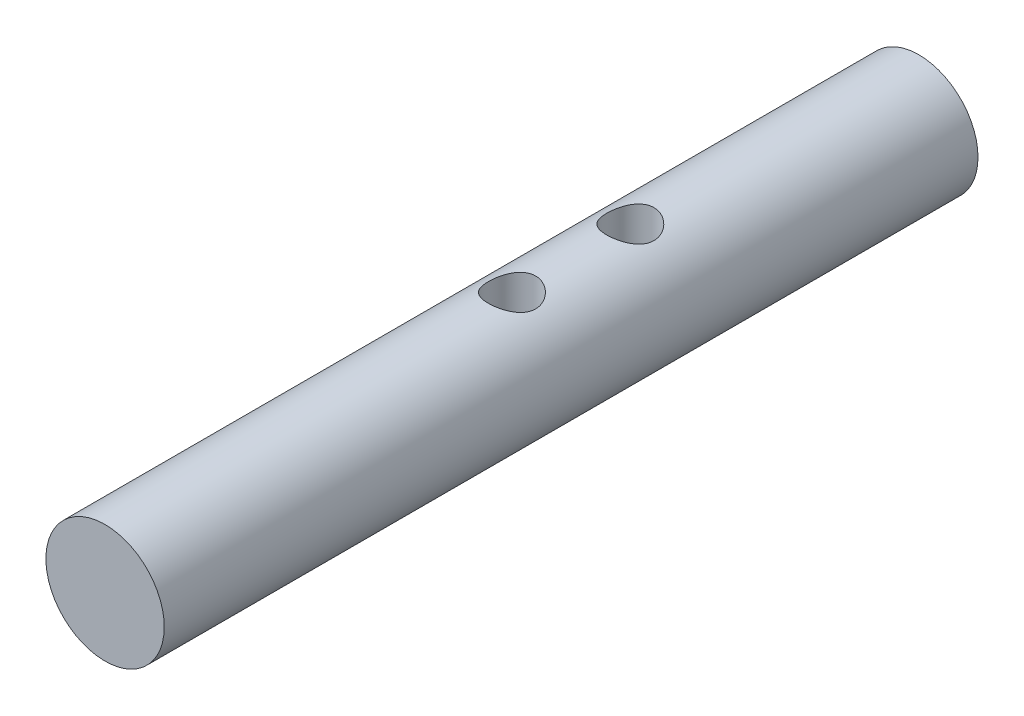
ISO-10303-21;
HEADER;
FILE_DESCRIPTION(('STEP AP214'),'2;1');
FILE_NAME('part.step','',(''),(''),'','','');
FILE_SCHEMA(('AUTOMOTIVE_DESIGN { 1 0 10303 214 1 1 1 1 }'));
ENDSEC;
DATA;
#1=APPLICATION_CONTEXT('core data for automotive mechanical design processes');
#2=APPLICATION_PROTOCOL_DEFINITION('international standard','automotive_design',2000,#1);
#3=PRODUCT_CONTEXT('',#1,'mechanical');
#4=PRODUCT('Part','Part','',(#3));
#5=PRODUCT_RELATED_PRODUCT_CATEGORY('part','',(#4));
#6=PRODUCT_DEFINITION_FORMATION('','',#4);
#7=PRODUCT_DEFINITION_CONTEXT('part definition',#1,'design');
#8=PRODUCT_DEFINITION('design','',#6,#7);
#9=PRODUCT_DEFINITION_SHAPE('','',#8);
#10=(LENGTH_UNIT() NAMED_UNIT(*) SI_UNIT(.MILLI.,.METRE.));
#11=(NAMED_UNIT(*) PLANE_ANGLE_UNIT() SI_UNIT($,.RADIAN.));
#12=(NAMED_UNIT(*) SI_UNIT($,.STERADIAN.) SOLID_ANGLE_UNIT());
#13=UNCERTAINTY_MEASURE_WITH_UNIT(LENGTH_MEASURE(1.E-05),#10,'distance_accuracy_value','');
#14=(GEOMETRIC_REPRESENTATION_CONTEXT(3) GLOBAL_UNCERTAINTY_ASSIGNED_CONTEXT((#13)) GLOBAL_UNIT_ASSIGNED_CONTEXT((#10,
#11,#12)) REPRESENTATION_CONTEXT('',''));
#15=CARTESIAN_POINT('',(0.,0.,0.));
#16=DIRECTION('',(0.,0.,1.));
#17=DIRECTION('',(1.,0.,0.));
#18=AXIS2_PLACEMENT_3D('',#15,#16,#17);
#19=CARTESIAN_POINT('',(0.,0.,55.));
#20=DIRECTION('',(0.,0.,-1.));
#21=DIRECTION('',(-1.,0.,0.));
#22=AXIS2_PLACEMENT_3D('',#19,#20,#21);
#23=CYLINDRICAL_SURFACE('',#22,4.);
#24=CARTESIAN_POINT('',(0.,-4.,21.1));
#25=CARTESIAN_POINT('',(0.0859944043543129,-3.99999416981668,21.099992118541));
#26=CARTESIAN_POINT('',(0.172138051272539,-3.99719435445546,21.0930257983293));
#27=CARTESIAN_POINT('',(0.341997184334316,-3.98626762480513,21.065401837183));
#28=CARTESIAN_POINT('',(0.425705422048998,-3.97812622959102,21.0447069767311));
#29=CARTESIAN_POINT('',(0.587963138181922,-3.95739367370495,20.9904991375529));
#30=CARTESIAN_POINT('',(0.666528529293567,-3.94481709091258,20.9570281230266));
#31=CARTESIAN_POINT('',(0.816857576262694,-3.91645288636862,20.8783846613388));
#32=CARTESIAN_POINT('',(0.888623581400793,-3.90066637966445,20.8332162760649));
#33=CARTESIAN_POINT('',(1.02680080605631,-3.86664708936335,20.7302116011513));
#34=CARTESIAN_POINT('',(1.09284981804017,-3.84833837543352,20.6719146750078));
#35=CARTESIAN_POINT('',(1.21454000382778,-3.81168461524956,20.5452799972186));
#36=CARTESIAN_POINT('',(1.27017608570683,-3.79333955563034,20.4769373622306));
#37=CARTESIAN_POINT('',(1.3718996538343,-3.75778233437709,20.3284575438062));
#38=CARTESIAN_POINT('',(1.41745198495638,-3.74065692771961,20.2479308111814));
#39=CARTESIAN_POINT('',(1.49420377522972,-3.71066917749434,20.079570881264));
#40=CARTESIAN_POINT('',(1.52541005142867,-3.69780480995341,19.9917411777213));
#41=CARTESIAN_POINT('',(1.57111905871669,-3.67861086128655,19.8154301331263));
#42=CARTESIAN_POINT('',(1.58631517264452,-3.67201136284484,19.727159011539));
#43=CARTESIAN_POINT('',(1.60173836931202,-3.66531203239315,19.5490920013542));
#44=CARTESIAN_POINT('',(1.60197281305058,-3.66520900418215,19.4592968843));
#45=CARTESIAN_POINT('',(1.58799149400364,-3.67128400223995,19.2873946628336));
#46=CARTESIAN_POINT('',(1.57478025144411,-3.6770254003076,19.2051874284728));
#47=CARTESIAN_POINT('',(1.53595750423826,-3.69340950086269,19.0442723551946));
#48=CARTESIAN_POINT('',(1.51034383584371,-3.70405305857338,18.9655651295118));
#49=CARTESIAN_POINT('',(1.44695578604086,-3.72927588070824,18.8119857310432));
#50=CARTESIAN_POINT('',(1.40894388985225,-3.7439310342463,18.7372246087563));
#51=CARTESIAN_POINT('',(1.32200516858577,-3.77550493111912,18.5948673469107));
#52=CARTESIAN_POINT('',(1.27307424408067,-3.79242452365479,18.5272739124778));
#53=CARTESIAN_POINT('',(1.16124047956355,-3.82821389393817,18.3956722169584));
#54=CARTESIAN_POINT('',(1.09754997037651,-3.84713331980921,18.3323450164432));
#55=CARTESIAN_POINT('',(0.960251541944153,-3.88367859966626,18.2170524175984));
#56=CARTESIAN_POINT('',(0.886641652267545,-3.9013041955626,18.1650892820718));
#57=CARTESIAN_POINT('',(0.729662122084673,-3.93371745011639,18.0731060420673));
#58=CARTESIAN_POINT('',(0.646128393077181,-3.94844216076332,18.0333421750424));
#59=CARTESIAN_POINT('',(0.472819012386306,-3.97291862663007,17.9686657111376));
#60=CARTESIAN_POINT('',(0.38304655747974,-3.98267290769906,17.9437455699541));
#61=CARTESIAN_POINT('',(0.205516710086257,-3.99564911605528,17.9108413636642));
#62=CARTESIAN_POINT('',(0.117954635188428,-3.99922356666811,17.9019420365972));
#63=CARTESIAN_POINT('',(-0.0574762478462532,-4.00054782808505,17.8986295195771));
#64=CARTESIAN_POINT('',(-0.145344970579138,-3.99829914865833,17.904212574762));
#65=CARTESIAN_POINT('',(-0.31474619129759,-3.98846053651002,17.9290334020416));
#66=CARTESIAN_POINT('',(-0.396385993420379,-3.98111513076419,17.9476463842808));
#67=CARTESIAN_POINT('',(-0.555308342448624,-3.962075531244,17.9971485666479));
#68=CARTESIAN_POINT('',(-0.632590328179875,-3.95038077885224,18.0280393437349));
#69=CARTESIAN_POINT('',(-0.783263028653361,-3.92333275816649,18.102227951744));
#70=CARTESIAN_POINT('',(-0.856462418204323,-3.90787852783843,18.1458763776345));
#71=CARTESIAN_POINT('',(-0.994754872997243,-3.8749869179642,18.2439522591245));
#72=CARTESIAN_POINT('',(-1.0598446726089,-3.85754874488216,18.2983840343381));
#73=CARTESIAN_POINT('',(-1.18457843442305,-3.82116094110489,18.4206960103597));
#74=CARTESIAN_POINT('',(-1.24357914704485,-3.80218753140042,18.489226833205));
#75=CARTESIAN_POINT('',(-1.34940095793097,-3.76593338333706,18.6355520664075));
#76=CARTESIAN_POINT('',(-1.39622004907001,-3.74865292421209,18.713348000272));
#77=CARTESIAN_POINT('',(-1.4766460015453,-3.71771439926167,18.8771693556753));
#78=CARTESIAN_POINT('',(-1.51012047562756,-3.7040930470783,18.9632671993698));
#79=CARTESIAN_POINT('',(-1.56183697576424,-3.68258938782345,19.1405869213721));
#80=CARTESIAN_POINT('',(-1.58009024421545,-3.67470284556799,19.2318049646499));
#81=CARTESIAN_POINT('',(-1.59977249382272,-3.66617407439941,19.4097023214196));
#82=CARTESIAN_POINT('',(-1.60231766584229,-3.66505136806537,19.4962358716747));
#83=CARTESIAN_POINT('',(-1.59344252742202,-3.66891868826478,19.6684358861706));
#84=CARTESIAN_POINT('',(-1.58202399033102,-3.67390793859835,19.7541024591221));
#85=CARTESIAN_POINT('',(-1.54645709292292,-3.68901319263217,19.918665751884));
#86=CARTESIAN_POINT('',(-1.52282999485678,-3.6989186546196,19.9976962195464));
#87=CARTESIAN_POINT('',(-1.46400435879281,-3.72259200986157,20.1507029036908));
#88=CARTESIAN_POINT('',(-1.42880262511505,-3.73636096964805,20.2246777175199));
#89=CARTESIAN_POINT('',(-1.34549821020778,-3.76718887683593,20.3700876954166));
#90=CARTESIAN_POINT('',(-1.29677226812759,-3.78439105850594,20.4411349361044));
#91=CARTESIAN_POINT('',(-1.1887136954172,-3.8197104349779,20.574394653763));
#92=CARTESIAN_POINT('',(-1.1293778678545,-3.83782790438725,20.6366044577026));
#93=CARTESIAN_POINT('',(-0.99720440501797,-3.87434853669915,20.7545622826109));
#94=CARTESIAN_POINT('',(-0.923740800916912,-3.89269406369748,20.8096298455185));
#95=CARTESIAN_POINT('',(-0.767920256228624,-3.92640325370973,20.9066696340973));
#96=CARTESIAN_POINT('',(-0.68555920363779,-3.94176552874325,20.948635769722));
#97=CARTESIAN_POINT('',(-0.515790449996162,-3.96751771852689,21.0172977721522));
#98=CARTESIAN_POINT('',(-0.428505294575756,-3.97799490444022,21.0442634588483));
#99=CARTESIAN_POINT('',(-0.250301237024975,-3.99315444967493,21.0829112967634));
#100=CARTESIAN_POINT('',(-0.159394820687128,-3.9978551959651,21.0946419493951));
#101=CARTESIAN_POINT('',(-0.0455298383127422,-3.99980719603309,21.0995163047826));
#102=CARTESIAN_POINT('',(-0.022770150992606,-4.00000154375341,21.1000020869034));
#103=CARTESIAN_POINT('',(0.,-4.,21.1));
#104=B_SPLINE_CURVE_WITH_KNOTS('',3,(#24,#25,#26,#27,#28,#29,#30,#31,#32,#33,#34,#35,#36,#37,
#38,#39,#40,#41,#42,#43,#44,#45,#46,#47,#48,#49,#50,#51,#52,#53,#54,#55,#56,#57,#58,#59,#60,#61,
#62,#63,#64,#65,#66,#67,#68,#69,#70,#71,#72,#73,#74,#75,#76,#77,#78,#79,#80,#81,#82,#83,#84,#85,
#86,#87,#88,#89,#90,#91,#92,#93,#94,#95,#96,#97,#98,#99,#100,#101,#102,#103),.UNSPECIFIED.,.T.,
.F.,(4,2,2,2,2,2,2,2,2,2,2,2,2,2,2,2,2,2,2,2,2,2,2,2,2,2,2,2,2,2,2,2,2,2,2,2,2,2,2,4),(0.,
0.257922390314456,0.516546908806347,0.774329165977263,1.03202202854387,1.30077905360318,
1.56966715947529,1.85052207055373,2.13124338494614,2.39923284247062,2.6670904507239,
2.91630662721098,3.16556629804838,3.41991301039053,3.67435537550547,3.94846679349246,
4.22263274271787,4.50221530530245,4.78165564891032,5.04455347622406,5.30738314856066,
5.55840364451493,5.80945639195037,6.0681881071861,6.32702367599175,6.60294779699531,
6.87891735234999,7.15756036112662,7.43599738116747,7.69439738714199,7.95276458050437,
8.20091454839016,8.44913308644129,8.71156374445354,8.97407361078715,9.25360338827069,
9.53326290912426,9.80771440810655,10.0812900192347,10.1495843671744),.UNSPECIFIED.);
#105=CARTESIAN_POINT('',(0.,-4.,21.1));
#106=VERTEX_POINT('',#105);
#107=EDGE_CURVE('E10',#106,#106,#104,.T.);
#108=ORIENTED_EDGE('',*,*,#107,.T.);
#109=EDGE_LOOP('',(#108));
#110=FACE_BOUND('',#109,.T.);
#111=CARTESIAN_POINT('',(0.,4.,21.1));
#112=CARTESIAN_POINT('',(-0.0859944043543129,3.99999416981668,21.099992118541));
#113=CARTESIAN_POINT('',(-0.172138051272539,3.99719435445546,21.0930257983293));
#114=CARTESIAN_POINT('',(-0.341997184334316,3.98626762480513,21.065401837183));
#115=CARTESIAN_POINT('',(-0.425705422048998,3.97812622959102,21.0447069767311));
#116=CARTESIAN_POINT('',(-0.587963138181922,3.95739367370495,20.9904991375529));
#117=CARTESIAN_POINT('',(-0.666528529293567,3.94481709091258,20.9570281230266));
#118=CARTESIAN_POINT('',(-0.816857576262694,3.91645288636862,20.8783846613388));
#119=CARTESIAN_POINT('',(-0.888623581400793,3.90066637966445,20.8332162760649));
#120=CARTESIAN_POINT('',(-1.02680080605631,3.86664708936335,20.7302116011513));
#121=CARTESIAN_POINT('',(-1.09284981804017,3.84833837543352,20.6719146750078));
#122=CARTESIAN_POINT('',(-1.21454000382778,3.81168461524956,20.5452799972186));
#123=CARTESIAN_POINT('',(-1.27017608570683,3.79333955563034,20.4769373622306));
#124=CARTESIAN_POINT('',(-1.3718996538343,3.75778233437709,20.3284575438062));
#125=CARTESIAN_POINT('',(-1.41745198495638,3.74065692771961,20.2479308111814));
#126=CARTESIAN_POINT('',(-1.49420377522972,3.71066917749434,20.079570881264));
#127=CARTESIAN_POINT('',(-1.52541005142867,3.69780480995341,19.9917411777213));
#128=CARTESIAN_POINT('',(-1.57111905871669,3.67861086128655,19.8154301331263));
#129=CARTESIAN_POINT('',(-1.58631517264452,3.67201136284484,19.727159011539));
#130=CARTESIAN_POINT('',(-1.60173836931202,3.66531203239315,19.5490920013542));
#131=CARTESIAN_POINT('',(-1.60197281305058,3.66520900418215,19.4592968843));
#132=CARTESIAN_POINT('',(-1.58799149400364,3.67128400223995,19.2873946628336));
#133=CARTESIAN_POINT('',(-1.57478025144411,3.6770254003076,19.2051874284728));
#134=CARTESIAN_POINT('',(-1.53595750423826,3.69340950086269,19.0442723551946));
#135=CARTESIAN_POINT('',(-1.51034383584371,3.70405305857338,18.9655651295118));
#136=CARTESIAN_POINT('',(-1.44695578604086,3.72927588070824,18.8119857310432));
#137=CARTESIAN_POINT('',(-1.40894388985225,3.7439310342463,18.7372246087563));
#138=CARTESIAN_POINT('',(-1.32200516858577,3.77550493111912,18.5948673469107));
#139=CARTESIAN_POINT('',(-1.27307424408067,3.79242452365479,18.5272739124778));
#140=CARTESIAN_POINT('',(-1.16124047956355,3.82821389393817,18.3956722169584));
#141=CARTESIAN_POINT('',(-1.09754997037651,3.84713331980921,18.3323450164432));
#142=CARTESIAN_POINT('',(-0.960251541944153,3.88367859966626,18.2170524175984));
#143=CARTESIAN_POINT('',(-0.886641652267545,3.9013041955626,18.1650892820718));
#144=CARTESIAN_POINT('',(-0.729662122084673,3.93371745011639,18.0731060420673));
#145=CARTESIAN_POINT('',(-0.646128393077181,3.94844216076332,18.0333421750424));
#146=CARTESIAN_POINT('',(-0.472819012386306,3.97291862663007,17.9686657111376));
#147=CARTESIAN_POINT('',(-0.38304655747974,3.98267290769906,17.9437455699541));
#148=CARTESIAN_POINT('',(-0.205516710086257,3.99564911605528,17.9108413636642));
#149=CARTESIAN_POINT('',(-0.117954635188428,3.99922356666811,17.9019420365972));
#150=CARTESIAN_POINT('',(0.0574762478462532,4.00054782808505,17.8986295195771));
#151=CARTESIAN_POINT('',(0.145344970579138,3.99829914865833,17.904212574762));
#152=CARTESIAN_POINT('',(0.31474619129759,3.98846053651002,17.9290334020416));
#153=CARTESIAN_POINT('',(0.396385993420379,3.98111513076419,17.9476463842808));
#154=CARTESIAN_POINT('',(0.555308342448624,3.962075531244,17.9971485666479));
#155=CARTESIAN_POINT('',(0.632590328179875,3.95038077885224,18.0280393437349));
#156=CARTESIAN_POINT('',(0.783263028653361,3.92333275816649,18.102227951744));
#157=CARTESIAN_POINT('',(0.856462418204323,3.90787852783843,18.1458763776345));
#158=CARTESIAN_POINT('',(0.994754872997243,3.8749869179642,18.2439522591245));
#159=CARTESIAN_POINT('',(1.0598446726089,3.85754874488216,18.2983840343381));
#160=CARTESIAN_POINT('',(1.18457843442305,3.82116094110489,18.4206960103597));
#161=CARTESIAN_POINT('',(1.24357914704485,3.80218753140042,18.489226833205));
#162=CARTESIAN_POINT('',(1.34940095793097,3.76593338333706,18.6355520664075));
#163=CARTESIAN_POINT('',(1.39622004907001,3.74865292421209,18.713348000272));
#164=CARTESIAN_POINT('',(1.4766460015453,3.71771439926167,18.8771693556753));
#165=CARTESIAN_POINT('',(1.51012047562756,3.7040930470783,18.9632671993698));
#166=CARTESIAN_POINT('',(1.56183697576424,3.68258938782345,19.1405869213721));
#167=CARTESIAN_POINT('',(1.58009024421545,3.67470284556799,19.2318049646499));
#168=CARTESIAN_POINT('',(1.59977249382272,3.66617407439941,19.4097023214196));
#169=CARTESIAN_POINT('',(1.60231766584229,3.66505136806537,19.4962358716747));
#170=CARTESIAN_POINT('',(1.59344252742202,3.66891868826478,19.6684358861706));
#171=CARTESIAN_POINT('',(1.58202399033102,3.67390793859835,19.7541024591221));
#172=CARTESIAN_POINT('',(1.54645709292292,3.68901319263217,19.918665751884));
#173=CARTESIAN_POINT('',(1.52282999485678,3.6989186546196,19.9976962195464));
#174=CARTESIAN_POINT('',(1.46400435879281,3.72259200986157,20.1507029036908));
#175=CARTESIAN_POINT('',(1.42880262511505,3.73636096964805,20.2246777175199));
#176=CARTESIAN_POINT('',(1.34549821020778,3.76718887683593,20.3700876954166));
#177=CARTESIAN_POINT('',(1.29677226812759,3.78439105850594,20.4411349361044));
#178=CARTESIAN_POINT('',(1.1887136954172,3.8197104349779,20.574394653763));
#179=CARTESIAN_POINT('',(1.1293778678545,3.83782790438725,20.6366044577026));
#180=CARTESIAN_POINT('',(0.99720440501797,3.87434853669915,20.7545622826109));
#181=CARTESIAN_POINT('',(0.923740800916912,3.89269406369748,20.8096298455185));
#182=CARTESIAN_POINT('',(0.767920256228624,3.92640325370973,20.9066696340973));
#183=CARTESIAN_POINT('',(0.68555920363779,3.94176552874325,20.948635769722));
#184=CARTESIAN_POINT('',(0.515790449996162,3.96751771852689,21.0172977721522));
#185=CARTESIAN_POINT('',(0.428505294575756,3.97799490444022,21.0442634588483));
#186=CARTESIAN_POINT('',(0.250301237024975,3.99315444967493,21.0829112967634));
#187=CARTESIAN_POINT('',(0.159394820687128,3.9978551959651,21.0946419493951));
#188=CARTESIAN_POINT('',(0.0455298383127422,3.99980719603309,21.0995163047826));
#189=CARTESIAN_POINT('',(0.022770150992606,4.00000154375341,21.1000020869034));
#190=CARTESIAN_POINT('',(0.,4.,21.1));
#191=B_SPLINE_CURVE_WITH_KNOTS('',3,(#111,#112,#113,#114,#115,#116,#117,#118,#119,#120,#121,
#122,#123,#124,#125,#126,#127,#128,#129,#130,#131,#132,#133,#134,#135,#136,#137,#138,#139,#140,
#141,#142,#143,#144,#145,#146,#147,#148,#149,#150,#151,#152,#153,#154,#155,#156,#157,#158,#159,
#160,#161,#162,#163,#164,#165,#166,#167,#168,#169,#170,#171,#172,#173,#174,#175,#176,#177,#178,
#179,#180,#181,#182,#183,#184,#185,#186,#187,#188,#189,#190),.UNSPECIFIED.,.T.,.F.,(4,2,2,2,2,2,
2,2,2,2,2,2,2,2,2,2,2,2,2,2,2,2,2,2,2,2,2,2,2,2,2,2,2,2,2,2,2,2,2,4),(0.,0.257922390314456,
0.516546908806347,0.774329165977263,1.03202202854387,1.30077905360318,1.56966715947529,
1.85052207055373,2.13124338494614,2.39923284247062,2.6670904507239,2.91630662721098,
3.16556629804838,3.41991301039053,3.67435537550547,3.94846679349246,4.22263274271787,
4.50221530530245,4.78165564891032,5.04455347622406,5.30738314856066,5.55840364451493,
5.80945639195037,6.0681881071861,6.32702367599175,6.60294779699531,6.87891735234999,
7.15756036112662,7.43599738116747,7.69439738714199,7.95276458050437,8.20091454839016,
8.44913308644129,8.71156374445354,8.97407361078715,9.25360338827069,9.53326290912426,
9.80771440810655,10.0812900192347,10.1495843671744),.UNSPECIFIED.);
#192=CARTESIAN_POINT('',(0.,4.,21.1));
#193=VERTEX_POINT('',#192);
#194=EDGE_CURVE('E41',#193,#193,#191,.T.);
#195=ORIENTED_EDGE('',*,*,#194,.T.);
#196=EDGE_LOOP('',(#195));
#197=FACE_BOUND('',#196,.T.);
#198=CARTESIAN_POINT('',(0.,-4.,29.1));
#199=CARTESIAN_POINT('',(0.0859944043543129,-3.99999416981668,29.099992118541));
#200=CARTESIAN_POINT('',(0.172138051272539,-3.99719435445546,29.0930257983293));
#201=CARTESIAN_POINT('',(0.341997184334316,-3.98626762480513,29.065401837183));
#202=CARTESIAN_POINT('',(0.425705422048998,-3.97812622959102,29.0447069767311));
#203=CARTESIAN_POINT('',(0.587963138181922,-3.95739367370495,28.9904991375529));
#204=CARTESIAN_POINT('',(0.666528529293567,-3.94481709091258,28.9570281230266));
#205=CARTESIAN_POINT('',(0.816857576262694,-3.91645288636862,28.8783846613388));
#206=CARTESIAN_POINT('',(0.888623581400793,-3.90066637966445,28.8332162760649));
#207=CARTESIAN_POINT('',(1.02680080605631,-3.86664708936335,28.7302116011513));
#208=CARTESIAN_POINT('',(1.09284981804017,-3.84833837543352,28.6719146750078));
#209=CARTESIAN_POINT('',(1.21454000382778,-3.81168461524956,28.5452799972186));
#210=CARTESIAN_POINT('',(1.27017608570683,-3.79333955563034,28.4769373622306));
#211=CARTESIAN_POINT('',(1.3718996538343,-3.75778233437709,28.3284575438062));
#212=CARTESIAN_POINT('',(1.41745198495638,-3.74065692771961,28.2479308111814));
#213=CARTESIAN_POINT('',(1.49420377522972,-3.71066917749434,28.079570881264));
#214=CARTESIAN_POINT('',(1.52541005142867,-3.69780480995341,27.9917411777213));
#215=CARTESIAN_POINT('',(1.57111905871669,-3.67861086128655,27.8154301331263));
#216=CARTESIAN_POINT('',(1.58631517264452,-3.67201136284484,27.727159011539));
#217=CARTESIAN_POINT('',(1.60173836931202,-3.66531203239315,27.5490920013542));
#218=CARTESIAN_POINT('',(1.60197281305058,-3.66520900418215,27.4592968843));
#219=CARTESIAN_POINT('',(1.58799149400364,-3.67128400223995,27.2873946628336));
#220=CARTESIAN_POINT('',(1.57478025144411,-3.6770254003076,27.2051874284728));
#221=CARTESIAN_POINT('',(1.53595750423826,-3.69340950086269,27.0442723551946));
#222=CARTESIAN_POINT('',(1.51034383584371,-3.70405305857338,26.9655651295118));
#223=CARTESIAN_POINT('',(1.44695578604086,-3.72927588070824,26.8119857310432));
#224=CARTESIAN_POINT('',(1.40894388985225,-3.7439310342463,26.7372246087562));
#225=CARTESIAN_POINT('',(1.32200516858577,-3.77550493111912,26.5948673469107));
#226=CARTESIAN_POINT('',(1.27307424408067,-3.79242452365479,26.5272739124778));
#227=CARTESIAN_POINT('',(1.16124047956355,-3.82821389393817,26.3956722169584));
#228=CARTESIAN_POINT('',(1.09754997037651,-3.84713331980921,26.3323450164432));
#229=CARTESIAN_POINT('',(0.960251541944153,-3.88367859966626,26.2170524175984));
#230=CARTESIAN_POINT('',(0.886641652267545,-3.9013041955626,26.1650892820718));
#231=CARTESIAN_POINT('',(0.729662122084673,-3.93371745011639,26.0731060420673));
#232=CARTESIAN_POINT('',(0.646128393077181,-3.94844216076332,26.0333421750424));
#233=CARTESIAN_POINT('',(0.472819012386306,-3.97291862663007,25.9686657111376));
#234=CARTESIAN_POINT('',(0.38304655747974,-3.98267290769906,25.9437455699541));
#235=CARTESIAN_POINT('',(0.205516710086257,-3.99564911605528,25.9108413636642));
#236=CARTESIAN_POINT('',(0.117954635188429,-3.99922356666811,25.9019420365972));
#237=CARTESIAN_POINT('',(-0.0574762478462531,-4.00054782808505,25.8986295195771));
#238=CARTESIAN_POINT('',(-0.145344970579138,-3.99829914865833,25.904212574762));
#239=CARTESIAN_POINT('',(-0.31474619129759,-3.98846053651002,25.9290334020416));
#240=CARTESIAN_POINT('',(-0.396385993420379,-3.98111513076419,25.9476463842808));
#241=CARTESIAN_POINT('',(-0.555308342448624,-3.962075531244,25.9971485666479));
#242=CARTESIAN_POINT('',(-0.632590328179875,-3.95038077885224,26.0280393437349));
#243=CARTESIAN_POINT('',(-0.783263028653361,-3.92333275816649,26.102227951744));
#244=CARTESIAN_POINT('',(-0.856462418204323,-3.90787852783843,26.1458763776345));
#245=CARTESIAN_POINT('',(-0.994754872997243,-3.8749869179642,26.2439522591245));
#246=CARTESIAN_POINT('',(-1.0598446726089,-3.85754874488216,26.2983840343381));
#247=CARTESIAN_POINT('',(-1.18457843442305,-3.82116094110489,26.4206960103597));
#248=CARTESIAN_POINT('',(-1.24357914704485,-3.80218753140042,26.489226833205));
#249=CARTESIAN_POINT('',(-1.34940095793097,-3.76593338333706,26.6355520664075));
#250=CARTESIAN_POINT('',(-1.39622004907001,-3.74865292421209,26.713348000272));
#251=CARTESIAN_POINT('',(-1.4766460015453,-3.71771439926167,26.8771693556753));
#252=CARTESIAN_POINT('',(-1.51012047562756,-3.7040930470783,26.9632671993698));
#253=CARTESIAN_POINT('',(-1.56183697576424,-3.68258938782345,27.1405869213721));
#254=CARTESIAN_POINT('',(-1.58009024421545,-3.67470284556799,27.2318049646499));
#255=CARTESIAN_POINT('',(-1.59977249382272,-3.66617407439941,27.4097023214196));
#256=CARTESIAN_POINT('',(-1.60231766584229,-3.66505136806537,27.4962358716747));
#257=CARTESIAN_POINT('',(-1.59344252742202,-3.66891868826478,27.6684358861706));
#258=CARTESIAN_POINT('',(-1.58202399033102,-3.67390793859835,27.7541024591221));
#259=CARTESIAN_POINT('',(-1.54645709292292,-3.68901319263217,27.918665751884));
#260=CARTESIAN_POINT('',(-1.52282999485678,-3.6989186546196,27.9976962195464));
#261=CARTESIAN_POINT('',(-1.46400435879281,-3.72259200986157,28.1507029036908));
#262=CARTESIAN_POINT('',(-1.42880262511505,-3.73636096964805,28.2246777175199));
#263=CARTESIAN_POINT('',(-1.34549821020778,-3.76718887683593,28.3700876954166));
#264=CARTESIAN_POINT('',(-1.29677226812759,-3.78439105850594,28.4411349361044));
#265=CARTESIAN_POINT('',(-1.1887136954172,-3.8197104349779,28.574394653763));
#266=CARTESIAN_POINT('',(-1.1293778678545,-3.83782790438725,28.6366044577026));
#267=CARTESIAN_POINT('',(-0.99720440501797,-3.87434853669915,28.7545622826109));
#268=CARTESIAN_POINT('',(-0.923740800916912,-3.89269406369748,28.8096298455185));
#269=CARTESIAN_POINT('',(-0.767920256228624,-3.92640325370973,28.9066696340973));
#270=CARTESIAN_POINT('',(-0.68555920363779,-3.94176552874325,28.948635769722));
#271=CARTESIAN_POINT('',(-0.515790449996162,-3.96751771852689,29.0172977721522));
#272=CARTESIAN_POINT('',(-0.428505294575756,-3.97799490444022,29.0442634588483));
#273=CARTESIAN_POINT('',(-0.250301237024975,-3.99315444967493,29.0829112967634));
#274=CARTESIAN_POINT('',(-0.159394820687128,-3.9978551959651,29.0946419493951));
#275=CARTESIAN_POINT('',(-0.0455298383127422,-3.99980719603309,29.0995163047826));
#276=CARTESIAN_POINT('',(-0.022770150992606,-4.00000154375341,29.1000020869034));
#277=CARTESIAN_POINT('',(0.,-4.,29.1));
#278=B_SPLINE_CURVE_WITH_KNOTS('',3,(#198,#199,#200,#201,#202,#203,#204,#205,#206,#207,#208,
#209,#210,#211,#212,#213,#214,#215,#216,#217,#218,#219,#220,#221,#222,#223,#224,#225,#226,#227,
#228,#229,#230,#231,#232,#233,#234,#235,#236,#237,#238,#239,#240,#241,#242,#243,#244,#245,#246,
#247,#248,#249,#250,#251,#252,#253,#254,#255,#256,#257,#258,#259,#260,#261,#262,#263,#264,#265,
#266,#267,#268,#269,#270,#271,#272,#273,#274,#275,#276,#277),.UNSPECIFIED.,.T.,.F.,(4,2,2,2,2,2,
2,2,2,2,2,2,2,2,2,2,2,2,2,2,2,2,2,2,2,2,2,2,2,2,2,2,2,2,2,2,2,2,2,4),(0.,0.257922390314456,
0.516546908806347,0.774329165977263,1.03202202854387,1.30077905360318,1.56966715947529,
1.85052207055373,2.13124338494614,2.39923284247062,2.6670904507239,2.91630662721098,
3.16556629804838,3.41991301039053,3.67435537550547,3.94846679349246,4.22263274271787,
4.50221530530245,4.78165564891032,5.04455347622406,5.30738314856066,5.55840364451493,
5.80945639195037,6.0681881071861,6.32702367599175,6.60294779699531,6.87891735234999,
7.15756036112662,7.43599738116747,7.69439738714199,7.95276458050437,8.20091454839016,
8.44913308644129,8.71156374445354,8.97407361078715,9.25360338827069,9.53326290912426,
9.80771440810655,10.0812900192347,10.1495843671744),.UNSPECIFIED.);
#279=CARTESIAN_POINT('',(0.,-4.,29.1));
#280=VERTEX_POINT('',#279);
#281=EDGE_CURVE('E45',#280,#280,#278,.T.);
#282=ORIENTED_EDGE('',*,*,#281,.T.);
#283=EDGE_LOOP('',(#282));
#284=FACE_BOUND('',#283,.T.);
#285=CARTESIAN_POINT('',(0.,4.,29.1));
#286=CARTESIAN_POINT('',(-0.0859944043543129,3.99999416981668,29.099992118541));
#287=CARTESIAN_POINT('',(-0.172138051272539,3.99719435445546,29.0930257983293));
#288=CARTESIAN_POINT('',(-0.341997184334316,3.98626762480513,29.065401837183));
#289=CARTESIAN_POINT('',(-0.425705422048998,3.97812622959102,29.0447069767311));
#290=CARTESIAN_POINT('',(-0.587963138181922,3.95739367370495,28.9904991375529));
#291=CARTESIAN_POINT('',(-0.666528529293567,3.94481709091258,28.9570281230266));
#292=CARTESIAN_POINT('',(-0.816857576262694,3.91645288636862,28.8783846613388));
#293=CARTESIAN_POINT('',(-0.888623581400793,3.90066637966445,28.8332162760649));
#294=CARTESIAN_POINT('',(-1.02680080605631,3.86664708936335,28.7302116011513));
#295=CARTESIAN_POINT('',(-1.09284981804017,3.84833837543352,28.6719146750078));
#296=CARTESIAN_POINT('',(-1.21454000382778,3.81168461524956,28.5452799972186));
#297=CARTESIAN_POINT('',(-1.27017608570683,3.79333955563034,28.4769373622306));
#298=CARTESIAN_POINT('',(-1.3718996538343,3.75778233437709,28.3284575438062));
#299=CARTESIAN_POINT('',(-1.41745198495638,3.74065692771961,28.2479308111814));
#300=CARTESIAN_POINT('',(-1.49420377522972,3.71066917749434,28.079570881264));
#301=CARTESIAN_POINT('',(-1.52541005142867,3.69780480995341,27.9917411777213));
#302=CARTESIAN_POINT('',(-1.57111905871669,3.67861086128655,27.8154301331263));
#303=CARTESIAN_POINT('',(-1.58631517264452,3.67201136284484,27.727159011539));
#304=CARTESIAN_POINT('',(-1.60173836931202,3.66531203239315,27.5490920013542));
#305=CARTESIAN_POINT('',(-1.60197281305058,3.66520900418215,27.4592968843));
#306=CARTESIAN_POINT('',(-1.58799149400364,3.67128400223995,27.2873946628336));
#307=CARTESIAN_POINT('',(-1.57478025144411,3.6770254003076,27.2051874284728));
#308=CARTESIAN_POINT('',(-1.53595750423826,3.69340950086269,27.0442723551946));
#309=CARTESIAN_POINT('',(-1.51034383584371,3.70405305857338,26.9655651295118));
#310=CARTESIAN_POINT('',(-1.44695578604086,3.72927588070824,26.8119857310432));
#311=CARTESIAN_POINT('',(-1.40894388985225,3.7439310342463,26.7372246087562));
#312=CARTESIAN_POINT('',(-1.32200516858577,3.77550493111912,26.5948673469107));
#313=CARTESIAN_POINT('',(-1.27307424408067,3.79242452365479,26.5272739124778));
#314=CARTESIAN_POINT('',(-1.16124047956355,3.82821389393817,26.3956722169584));
#315=CARTESIAN_POINT('',(-1.09754997037651,3.84713331980921,26.3323450164432));
#316=CARTESIAN_POINT('',(-0.960251541944153,3.88367859966626,26.2170524175984));
#317=CARTESIAN_POINT('',(-0.886641652267545,3.9013041955626,26.1650892820718));
#318=CARTESIAN_POINT('',(-0.729662122084673,3.93371745011639,26.0731060420673));
#319=CARTESIAN_POINT('',(-0.646128393077181,3.94844216076332,26.0333421750424));
#320=CARTESIAN_POINT('',(-0.472819012386306,3.97291862663007,25.9686657111376));
#321=CARTESIAN_POINT('',(-0.38304655747974,3.98267290769906,25.9437455699541));
#322=CARTESIAN_POINT('',(-0.205516710086257,3.99564911605528,25.9108413636642));
#323=CARTESIAN_POINT('',(-0.117954635188429,3.99922356666811,25.9019420365972));
#324=CARTESIAN_POINT('',(0.0574762478462531,4.00054782808505,25.8986295195771));
#325=CARTESIAN_POINT('',(0.145344970579138,3.99829914865833,25.904212574762));
#326=CARTESIAN_POINT('',(0.31474619129759,3.98846053651002,25.9290334020416));
#327=CARTESIAN_POINT('',(0.396385993420379,3.98111513076419,25.9476463842808));
#328=CARTESIAN_POINT('',(0.555308342448624,3.962075531244,25.9971485666479));
#329=CARTESIAN_POINT('',(0.632590328179875,3.95038077885224,26.0280393437349));
#330=CARTESIAN_POINT('',(0.783263028653361,3.92333275816649,26.102227951744));
#331=CARTESIAN_POINT('',(0.856462418204323,3.90787852783843,26.1458763776345));
#332=CARTESIAN_POINT('',(0.994754872997243,3.8749869179642,26.2439522591245));
#333=CARTESIAN_POINT('',(1.0598446726089,3.85754874488216,26.2983840343381));
#334=CARTESIAN_POINT('',(1.18457843442305,3.82116094110489,26.4206960103597));
#335=CARTESIAN_POINT('',(1.24357914704485,3.80218753140042,26.489226833205));
#336=CARTESIAN_POINT('',(1.34940095793097,3.76593338333706,26.6355520664075));
#337=CARTESIAN_POINT('',(1.39622004907001,3.74865292421209,26.713348000272));
#338=CARTESIAN_POINT('',(1.4766460015453,3.71771439926167,26.8771693556753));
#339=CARTESIAN_POINT('',(1.51012047562756,3.7040930470783,26.9632671993698));
#340=CARTESIAN_POINT('',(1.56183697576424,3.68258938782345,27.1405869213721));
#341=CARTESIAN_POINT('',(1.58009024421545,3.67470284556799,27.2318049646499));
#342=CARTESIAN_POINT('',(1.59977249382272,3.66617407439941,27.4097023214196));
#343=CARTESIAN_POINT('',(1.60231766584229,3.66505136806537,27.4962358716747));
#344=CARTESIAN_POINT('',(1.59344252742202,3.66891868826478,27.6684358861706));
#345=CARTESIAN_POINT('',(1.58202399033102,3.67390793859835,27.7541024591221));
#346=CARTESIAN_POINT('',(1.54645709292292,3.68901319263217,27.918665751884));
#347=CARTESIAN_POINT('',(1.52282999485678,3.6989186546196,27.9976962195464));
#348=CARTESIAN_POINT('',(1.46400435879281,3.72259200986157,28.1507029036908));
#349=CARTESIAN_POINT('',(1.42880262511505,3.73636096964805,28.2246777175199));
#350=CARTESIAN_POINT('',(1.34549821020778,3.76718887683593,28.3700876954166));
#351=CARTESIAN_POINT('',(1.29677226812759,3.78439105850594,28.4411349361044));
#352=CARTESIAN_POINT('',(1.1887136954172,3.8197104349779,28.574394653763));
#353=CARTESIAN_POINT('',(1.1293778678545,3.83782790438725,28.6366044577026));
#354=CARTESIAN_POINT('',(0.99720440501797,3.87434853669915,28.7545622826109));
#355=CARTESIAN_POINT('',(0.923740800916912,3.89269406369748,28.8096298455185));
#356=CARTESIAN_POINT('',(0.767920256228624,3.92640325370973,28.9066696340973));
#357=CARTESIAN_POINT('',(0.68555920363779,3.94176552874325,28.948635769722));
#358=CARTESIAN_POINT('',(0.515790449996162,3.96751771852689,29.0172977721522));
#359=CARTESIAN_POINT('',(0.428505294575756,3.97799490444022,29.0442634588483));
#360=CARTESIAN_POINT('',(0.250301237024975,3.99315444967493,29.0829112967634));
#361=CARTESIAN_POINT('',(0.159394820687128,3.9978551959651,29.0946419493951));
#362=CARTESIAN_POINT('',(0.0455298383127422,3.99980719603309,29.0995163047826));
#363=CARTESIAN_POINT('',(0.022770150992606,4.00000154375341,29.1000020869034));
#364=CARTESIAN_POINT('',(0.,4.,29.1));
#365=B_SPLINE_CURVE_WITH_KNOTS('',3,(#285,#286,#287,#288,#289,#290,#291,#292,#293,#294,#295,
#296,#297,#298,#299,#300,#301,#302,#303,#304,#305,#306,#307,#308,#309,#310,#311,#312,#313,#314,
#315,#316,#317,#318,#319,#320,#321,#322,#323,#324,#325,#326,#327,#328,#329,#330,#331,#332,#333,
#334,#335,#336,#337,#338,#339,#340,#341,#342,#343,#344,#345,#346,#347,#348,#349,#350,#351,#352,
#353,#354,#355,#356,#357,#358,#359,#360,#361,#362,#363,#364),.UNSPECIFIED.,.T.,.F.,(4,2,2,2,2,2,
2,2,2,2,2,2,2,2,2,2,2,2,2,2,2,2,2,2,2,2,2,2,2,2,2,2,2,2,2,2,2,2,2,4),(0.,0.257922390314456,
0.516546908806347,0.774329165977263,1.03202202854387,1.30077905360318,1.56966715947529,
1.85052207055373,2.13124338494614,2.39923284247062,2.6670904507239,2.91630662721098,
3.16556629804838,3.41991301039053,3.67435537550547,3.94846679349246,4.22263274271787,
4.50221530530245,4.78165564891032,5.04455347622406,5.30738314856066,5.55840364451493,
5.80945639195037,6.0681881071861,6.32702367599175,6.60294779699531,6.87891735234999,
7.15756036112662,7.43599738116747,7.69439738714199,7.95276458050437,8.20091454839016,
8.44913308644129,8.71156374445354,8.97407361078715,9.25360338827069,9.53326290912426,
9.80771440810655,10.0812900192347,10.1495843671744),.UNSPECIFIED.);
#366=CARTESIAN_POINT('',(0.,4.,29.1));
#367=VERTEX_POINT('',#366);
#368=EDGE_CURVE('E49',#367,#367,#365,.T.);
#369=ORIENTED_EDGE('',*,*,#368,.T.);
#370=EDGE_LOOP('',(#369));
#371=FACE_BOUND('',#370,.T.);
#372=CARTESIAN_POINT('',(0.,0.,55.));
#373=DIRECTION('',(0.,0.,1.));
#374=DIRECTION('',(1.,0.,0.));
#375=AXIS2_PLACEMENT_3D('',#372,#373,#374);
#376=CIRCLE('',#375,4.);
#377=CARTESIAN_POINT('',(4.,0.,55.));
#378=VERTEX_POINT('',#377);
#379=EDGE_CURVE('E74',#378,#378,#376,.T.);
#380=ORIENTED_EDGE('',*,*,#379,.F.);
#381=EDGE_LOOP('',(#380));
#382=FACE_BOUND('',#381,.T.);
#383=CARTESIAN_POINT('',(0.,0.,0.));
#384=DIRECTION('',(0.,0.,1.));
#385=DIRECTION('',(1.,0.,0.));
#386=AXIS2_PLACEMENT_3D('',#383,#384,#385);
#387=CIRCLE('',#386,4.);
#388=CARTESIAN_POINT('',(4.,0.,0.));
#389=VERTEX_POINT('',#388);
#390=EDGE_CURVE('E75',#389,#389,#387,.T.);
#391=ORIENTED_EDGE('',*,*,#390,.T.);
#392=EDGE_LOOP('',(#391));
#393=FACE_BOUND('',#392,.T.);
#394=ADVANCED_FACE('F31',(#110,#197,#284,#371,#382,#393),#23,.T.);
#395=CARTESIAN_POINT('',(0.,0.,55.));
#396=DIRECTION('',(0.,0.,1.));
#397=DIRECTION('',(1.,0.,0.));
#398=AXIS2_PLACEMENT_3D('',#395,#396,#397);
#399=PLANE('',#398);
#400=ORIENTED_EDGE('',*,*,#379,.T.);
#401=EDGE_LOOP('',(#400));
#402=FACE_BOUND('',#401,.T.);
#403=ADVANCED_FACE('F68',(#402),#399,.T.);
#404=CARTESIAN_POINT('',(0.,0.,0.));
#405=DIRECTION('',(0.,0.,1.));
#406=DIRECTION('',(1.,0.,0.));
#407=AXIS2_PLACEMENT_3D('',#404,#405,#406);
#408=PLANE('',#407);
#409=ORIENTED_EDGE('',*,*,#390,.F.);
#410=EDGE_LOOP('',(#409));
#411=FACE_BOUND('',#410,.T.);
#412=ADVANCED_FACE('F66',(#411),#408,.F.);
#413=CARTESIAN_POINT('',(0.,-4.,27.5));
#414=DIRECTION('',(0.,1.,0.));
#415=DIRECTION('',(0.,0.,1.));
#416=AXIS2_PLACEMENT_3D('',#413,#414,#415);
#417=CYLINDRICAL_SURFACE('',#416,1.6);
#418=ORIENTED_EDGE('',*,*,#368,.F.);
#419=EDGE_LOOP('',(#418));
#420=FACE_BOUND('',#419,.T.);
#421=ORIENTED_EDGE('',*,*,#281,.F.);
#422=EDGE_LOOP('',(#421));
#423=FACE_BOUND('',#422,.T.);
#424=ADVANCED_FACE('F60',(#420,#423),#417,.F.);
#425=CARTESIAN_POINT('',(0.,-4.,19.5));
#426=DIRECTION('',(0.,1.,0.));
#427=DIRECTION('',(0.,0.,1.));
#428=AXIS2_PLACEMENT_3D('',#425,#426,#427);
#429=CYLINDRICAL_SURFACE('',#428,1.6);
#430=ORIENTED_EDGE('',*,*,#194,.F.);
#431=EDGE_LOOP('',(#430));
#432=FACE_BOUND('',#431,.T.);
#433=ORIENTED_EDGE('',*,*,#107,.F.);
#434=EDGE_LOOP('',(#433));
#435=FACE_BOUND('',#434,.T.);
#436=ADVANCED_FACE('F57',(#432,#435),#429,.F.);
#437=CLOSED_SHELL('',(#394,#403,#412,#424,#436));
#438=MANIFOLD_SOLID_BREP('B2',#437);
#439=ADVANCED_BREP_SHAPE_REPRESENTATION('',(#18,#438),#14);
#440=SHAPE_DEFINITION_REPRESENTATION(#9,#439);
ENDSEC;
END-ISO-10303-21;
